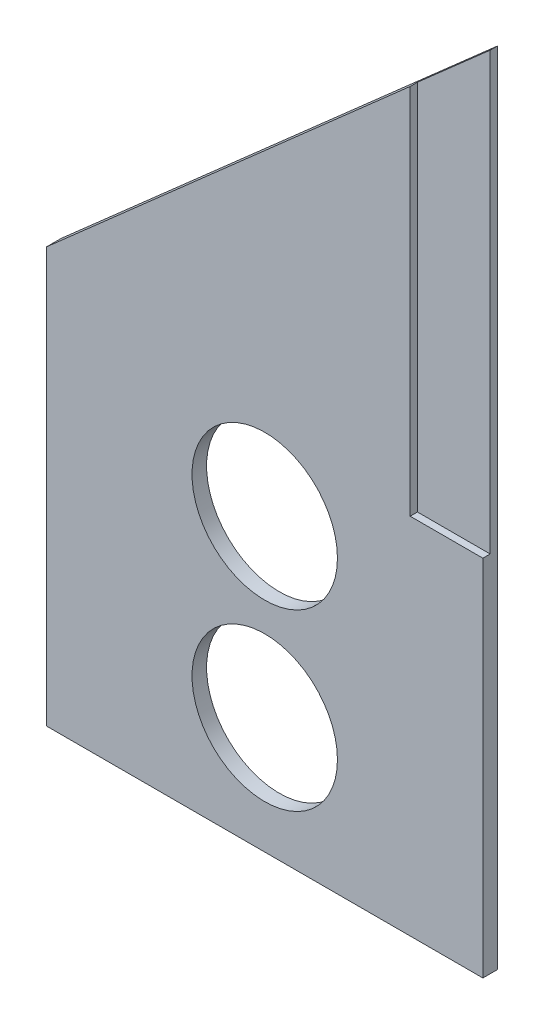
ISO-10303-21;
HEADER;
FILE_DESCRIPTION(('STEP AP214'),'2;1');
FILE_NAME('part.step','',(''),(''),'','','');
FILE_SCHEMA(('AUTOMOTIVE_DESIGN { 1 0 10303 214 1 1 1 1 }'));
ENDSEC;
DATA;
#1=APPLICATION_CONTEXT('core data for automotive mechanical design processes');
#2=APPLICATION_PROTOCOL_DEFINITION('international standard','automotive_design',2000,#1);
#3=PRODUCT_CONTEXT('',#1,'mechanical');
#4=PRODUCT('Part','Part','',(#3));
#5=PRODUCT_RELATED_PRODUCT_CATEGORY('part','',(#4));
#6=PRODUCT_DEFINITION_FORMATION('','',#4);
#7=PRODUCT_DEFINITION_CONTEXT('part definition',#1,'design');
#8=PRODUCT_DEFINITION('design','',#6,#7);
#9=PRODUCT_DEFINITION_SHAPE('','',#8);
#10=(LENGTH_UNIT() NAMED_UNIT(*) SI_UNIT(.MILLI.,.METRE.));
#11=(NAMED_UNIT(*) PLANE_ANGLE_UNIT() SI_UNIT($,.RADIAN.));
#12=(NAMED_UNIT(*) SI_UNIT($,.STERADIAN.) SOLID_ANGLE_UNIT());
#13=UNCERTAINTY_MEASURE_WITH_UNIT(LENGTH_MEASURE(1.E-05),#10,'distance_accuracy_value','');
#14=(GEOMETRIC_REPRESENTATION_CONTEXT(3) GLOBAL_UNCERTAINTY_ASSIGNED_CONTEXT((#13)) GLOBAL_UNIT_ASSIGNED_CONTEXT((#10,
#11,#12)) REPRESENTATION_CONTEXT('',''));
#15=CARTESIAN_POINT('',(0.,0.,0.));
#16=DIRECTION('',(0.,0.,1.));
#17=DIRECTION('',(1.,0.,0.));
#18=AXIS2_PLACEMENT_3D('',#15,#16,#17);
#19=CARTESIAN_POINT('',(-24.8805587892899,19.3298519873607,1.));
#20=DIRECTION('',(-1.,0.,0.));
#21=DIRECTION('',(0.,-1.,0.));
#22=AXIS2_PLACEMENT_3D('',#19,#20,#21);
#23=PLANE('',#22);
#24=DIRECTION('',(0.,1.,0.));
#25=VECTOR('',#24,1.);
#26=CARTESIAN_POINT('',(-24.8805587892899,19.3298519873607,0.5));
#27=LINE('',#26,#25);
#28=CARTESIAN_POINT('',(-24.8805587892899,-10.6701480126393,0.5));
#29=VERTEX_POINT('',#28);
#30=CARTESIAN_POINT('',(-24.8805587892899,19.3298519873607,0.5));
#31=VERTEX_POINT('',#30);
#32=EDGE_CURVE('E106',#29,#31,#27,.T.);
#33=ORIENTED_EDGE('',*,*,#32,.F.);
#34=DIRECTION('',(0.,0.,1.));
#35=VECTOR('',#34,1.);
#36=CARTESIAN_POINT('',(-24.8805587892899,-10.6701480126393,0.5));
#37=LINE('',#36,#35);
#38=CARTESIAN_POINT('',(-24.8805587892899,-10.6701480126393,1.));
#39=VERTEX_POINT('',#38);
#40=EDGE_CURVE('E148',#29,#39,#37,.T.);
#41=ORIENTED_EDGE('',*,*,#40,.T.);
#42=DIRECTION('',(0.,1.,0.));
#43=VECTOR('',#42,1.);
#44=CARTESIAN_POINT('',(-24.8805587892899,19.3298519873607,1.));
#45=LINE('',#44,#43);
#46=CARTESIAN_POINT('',(-24.8805587892899,-35.6701480126393,1.));
#47=VERTEX_POINT('',#46);
#48=EDGE_CURVE('E153',#47,#39,#45,.T.);
#49=ORIENTED_EDGE('',*,*,#48,.F.);
#50=DIRECTION('',(0.,0.,-1.));
#51=VECTOR('',#50,1.);
#52=CARTESIAN_POINT('',(-24.8805587892899,-35.6701480126393,1.));
#53=LINE('',#52,#51);
#54=CARTESIAN_POINT('',(-24.8805587892899,-35.6701480126393,0.));
#55=VERTEX_POINT('',#54);
#56=EDGE_CURVE('E159',#47,#55,#53,.T.);
#57=ORIENTED_EDGE('',*,*,#56,.T.);
#58=DIRECTION('',(0.,1.,0.));
#59=VECTOR('',#58,1.);
#60=CARTESIAN_POINT('',(-24.8805587892899,19.3298519873607,0.));
#61=LINE('',#60,#59);
#62=CARTESIAN_POINT('',(-24.8805587892899,19.3298519873607,0.));
#63=VERTEX_POINT('',#62);
#64=EDGE_CURVE('E122',#55,#63,#61,.T.);
#65=ORIENTED_EDGE('',*,*,#64,.T.);
#66=DIRECTION('',(0.,0.,-1.));
#67=VECTOR('',#66,1.);
#68=CARTESIAN_POINT('',(-24.8805587892899,19.3298519873607,1.));
#69=LINE('',#68,#67);
#70=EDGE_CURVE('E118',#31,#63,#69,.T.);
#71=ORIENTED_EDGE('',*,*,#70,.F.);
#72=EDGE_LOOP('',(#33,#41,#49,#57,#65,#71));
#73=FACE_BOUND('',#72,.T.);
#74=ADVANCED_FACE('F36',(#73),#23,.F.);
#75=CARTESIAN_POINT('',(-24.8805587892899,19.3298519873607,1.));
#76=DIRECTION('',(0.661437827766148,-0.75,0.));
#77=DIRECTION('',(0.75,0.661437827766148,0.));
#78=AXIS2_PLACEMENT_3D('',#75,#76,#77);
#79=PLANE('',#78);
#80=DIRECTION('',(-0.75,-0.661437827766148,0.));
#81=VECTOR('',#80,1.);
#82=CARTESIAN_POINT('',(-24.8805587892899,19.3298519873607,1.));
#83=LINE('',#82,#81);
#84=CARTESIAN_POINT('',(-29.8805587892899,14.9202664689197,1.));
#85=VERTEX_POINT('',#84);
#86=CARTESIAN_POINT('',(-54.8805587892899,-7.12766112328518,1.));
#87=VERTEX_POINT('',#86);
#88=EDGE_CURVE('E85',#85,#87,#83,.T.);
#89=ORIENTED_EDGE('',*,*,#88,.F.);
#90=DIRECTION('',(0.,0.,-1.));
#91=VECTOR('',#90,1.);
#92=CARTESIAN_POINT('',(-29.8805587892899,14.9202664689197,1.));
#93=LINE('',#92,#91);
#94=CARTESIAN_POINT('',(-29.8805587892899,14.9202664689197,0.5));
#95=VERTEX_POINT('',#94);
#96=EDGE_CURVE('E52',#85,#95,#93,.T.);
#97=ORIENTED_EDGE('',*,*,#96,.T.);
#98=DIRECTION('',(0.75,0.661437827766148,0.));
#99=VECTOR('',#98,1.);
#100=CARTESIAN_POINT('',(-24.8805587892899,19.3298519873607,0.5));
#101=LINE('',#100,#99);
#102=EDGE_CURVE('E11',#95,#31,#101,.T.);
#103=ORIENTED_EDGE('',*,*,#102,.T.);
#104=ORIENTED_EDGE('',*,*,#70,.T.);
#105=DIRECTION('',(-0.75,-0.661437827766148,0.));
#106=VECTOR('',#105,1.);
#107=CARTESIAN_POINT('',(-24.8805587892899,19.3298519873607,0.));
#108=LINE('',#107,#106);
#109=CARTESIAN_POINT('',(-54.8805587892899,-7.12766112328518,0.));
#110=VERTEX_POINT('',#109);
#111=EDGE_CURVE('E161',#63,#110,#108,.T.);
#112=ORIENTED_EDGE('',*,*,#111,.T.);
#113=DIRECTION('',(0.,0.,-1.));
#114=VECTOR('',#113,1.);
#115=CARTESIAN_POINT('',(-54.8805587892899,-7.12766112328518,1.));
#116=LINE('',#115,#114);
#117=EDGE_CURVE('E123',#87,#110,#116,.T.);
#118=ORIENTED_EDGE('',*,*,#117,.F.);
#119=EDGE_LOOP('',(#89,#97,#103,#104,#112,#118));
#120=FACE_BOUND('',#119,.T.);
#121=ADVANCED_FACE('F117',(#120),#79,.F.);
#122=CARTESIAN_POINT('',(-54.8805587892899,-7.12766112328518,1.));
#123=DIRECTION('',(1.,0.,0.));
#124=DIRECTION('',(0.,1.,0.));
#125=AXIS2_PLACEMENT_3D('',#122,#123,#124);
#126=PLANE('',#125);
#127=DIRECTION('',(0.,-1.,0.));
#128=VECTOR('',#127,1.);
#129=CARTESIAN_POINT('',(-54.8805587892899,-7.12766112328518,0.));
#130=LINE('',#129,#128);
#131=CARTESIAN_POINT('',(-54.8805587892898,-35.6701480126393,0.));
#132=VERTEX_POINT('',#131);
#133=EDGE_CURVE('E163',#110,#132,#130,.T.);
#134=ORIENTED_EDGE('',*,*,#133,.T.);
#135=DIRECTION('',(0.,0.,-1.));
#136=VECTOR('',#135,1.);
#137=CARTESIAN_POINT('',(-54.8805587892898,-35.6701480126393,1.));
#138=LINE('',#137,#136);
#139=CARTESIAN_POINT('',(-54.8805587892898,-35.6701480126393,1.));
#140=VERTEX_POINT('',#139);
#141=EDGE_CURVE('E127',#140,#132,#138,.T.);
#142=ORIENTED_EDGE('',*,*,#141,.F.);
#143=DIRECTION('',(0.,-1.,0.));
#144=VECTOR('',#143,1.);
#145=CARTESIAN_POINT('',(-54.8805587892899,-7.12766112328518,1.));
#146=LINE('',#145,#144);
#147=EDGE_CURVE('E156',#87,#140,#146,.T.);
#148=ORIENTED_EDGE('',*,*,#147,.F.);
#149=ORIENTED_EDGE('',*,*,#117,.T.);
#150=EDGE_LOOP('',(#134,#142,#148,#149));
#151=FACE_BOUND('',#150,.T.);
#152=ADVANCED_FACE('F173',(#151),#126,.F.);
#153=CARTESIAN_POINT('',(-54.8805587892898,-35.6701480126393,1.));
#154=DIRECTION('',(0.,1.,0.));
#155=DIRECTION('',(0.,0.,1.));
#156=AXIS2_PLACEMENT_3D('',#153,#154,#155);
#157=PLANE('',#156);
#158=DIRECTION('',(1.,0.,0.));
#159=VECTOR('',#158,1.);
#160=CARTESIAN_POINT('',(-54.8805587892898,-35.6701480126393,0.));
#161=LINE('',#160,#159);
#162=EDGE_CURVE('E81',#132,#55,#161,.T.);
#163=ORIENTED_EDGE('',*,*,#162,.T.);
#164=ORIENTED_EDGE('',*,*,#56,.F.);
#165=DIRECTION('',(1.,0.,0.));
#166=VECTOR('',#165,1.);
#167=CARTESIAN_POINT('',(-54.8805587892898,-35.6701480126393,1.));
#168=LINE('',#167,#166);
#169=EDGE_CURVE('E61',#140,#47,#168,.T.);
#170=ORIENTED_EDGE('',*,*,#169,.F.);
#171=ORIENTED_EDGE('',*,*,#141,.T.);
#172=EDGE_LOOP('',(#163,#164,#170,#171));
#173=FACE_BOUND('',#172,.T.);
#174=ADVANCED_FACE('F167',(#173),#157,.F.);
#175=CARTESIAN_POINT('',(0.,0.,1.));
#176=DIRECTION('',(0.,0.,1.));
#177=DIRECTION('',(1.,0.,0.));
#178=AXIS2_PLACEMENT_3D('',#175,#176,#177);
#179=PLANE('',#178);
#180=CARTESIAN_POINT('',(-39.8805587892899,-27.6701480126393,1.));
#181=DIRECTION('',(0.,0.,1.));
#182=DIRECTION('',(1.,0.,0.));
#183=AXIS2_PLACEMENT_3D('',#180,#181,#182);
#184=CIRCLE('',#183,5.);
#185=CARTESIAN_POINT('',(-34.8805587892899,-27.6701480126393,1.));
#186=VERTEX_POINT('',#185);
#187=EDGE_CURVE('E132',#186,#186,#184,.T.);
#188=ORIENTED_EDGE('',*,*,#187,.F.);
#189=EDGE_LOOP('',(#188));
#190=FACE_BOUND('',#189,.T.);
#191=CARTESIAN_POINT('',(-39.8805587892899,-15.6701480126393,1.));
#192=DIRECTION('',(0.,0.,1.));
#193=DIRECTION('',(1.,0.,0.));
#194=AXIS2_PLACEMENT_3D('',#191,#192,#193);
#195=CIRCLE('',#194,5.);
#196=CARTESIAN_POINT('',(-34.8805587892899,-15.6701480126393,1.));
#197=VERTEX_POINT('',#196);
#198=EDGE_CURVE('E137',#197,#197,#195,.T.);
#199=ORIENTED_EDGE('',*,*,#198,.F.);
#200=EDGE_LOOP('',(#199));
#201=FACE_BOUND('',#200,.T.);
#202=DIRECTION('',(1.,0.,0.));
#203=VECTOR('',#202,1.);
#204=CARTESIAN_POINT('',(-24.8805587892899,-10.6701480126393,1.));
#205=LINE('',#204,#203);
#206=CARTESIAN_POINT('',(-29.8805587892899,-10.6701480126393,1.));
#207=VERTEX_POINT('',#206);
#208=EDGE_CURVE('E114',#207,#39,#205,.T.);
#209=ORIENTED_EDGE('',*,*,#208,.F.);
#210=DIRECTION('',(0.,-1.,0.));
#211=VECTOR('',#210,1.);
#212=CARTESIAN_POINT('',(-29.8805587892899,0.,1.));
#213=LINE('',#212,#211);
#214=EDGE_CURVE('E44',#85,#207,#213,.T.);
#215=ORIENTED_EDGE('',*,*,#214,.F.);
#216=ORIENTED_EDGE('',*,*,#88,.T.);
#217=ORIENTED_EDGE('',*,*,#147,.T.);
#218=ORIENTED_EDGE('',*,*,#169,.T.);
#219=ORIENTED_EDGE('',*,*,#48,.T.);
#220=EDGE_LOOP('',(#209,#215,#216,#217,#218,#219));
#221=FACE_BOUND('',#220,.T.);
#222=ADVANCED_FACE('F175',(#190,#201,#221),#179,.T.);
#223=CARTESIAN_POINT('',(0.,0.,0.));
#224=DIRECTION('',(0.,0.,1.));
#225=DIRECTION('',(1.,0.,0.));
#226=AXIS2_PLACEMENT_3D('',#223,#224,#225);
#227=PLANE('',#226);
#228=CARTESIAN_POINT('',(-39.8805587892899,-27.6701480126393,0.));
#229=DIRECTION('',(0.,0.,1.));
#230=DIRECTION('',(1.,0.,0.));
#231=AXIS2_PLACEMENT_3D('',#228,#229,#230);
#232=CIRCLE('',#231,5.);
#233=CARTESIAN_POINT('',(-34.8805587892899,-27.6701480126393,0.));
#234=VERTEX_POINT('',#233);
#235=EDGE_CURVE('E39',#234,#234,#232,.T.);
#236=ORIENTED_EDGE('',*,*,#235,.T.);
#237=EDGE_LOOP('',(#236));
#238=FACE_BOUND('',#237,.T.);
#239=CARTESIAN_POINT('',(-39.8805587892899,-15.6701480126393,0.));
#240=DIRECTION('',(0.,0.,1.));
#241=DIRECTION('',(1.,0.,0.));
#242=AXIS2_PLACEMENT_3D('',#239,#240,#241);
#243=CIRCLE('',#242,5.);
#244=CARTESIAN_POINT('',(-34.8805587892899,-15.6701480126393,0.));
#245=VERTEX_POINT('',#244);
#246=EDGE_CURVE('E130',#245,#245,#243,.T.);
#247=ORIENTED_EDGE('',*,*,#246,.T.);
#248=EDGE_LOOP('',(#247));
#249=FACE_BOUND('',#248,.T.);
#250=ORIENTED_EDGE('',*,*,#64,.F.);
#251=ORIENTED_EDGE('',*,*,#162,.F.);
#252=ORIENTED_EDGE('',*,*,#133,.F.);
#253=ORIENTED_EDGE('',*,*,#111,.F.);
#254=EDGE_LOOP('',(#250,#251,#252,#253));
#255=FACE_BOUND('',#254,.T.);
#256=ADVANCED_FACE('F172',(#238,#249,#255),#227,.F.);
#257=CARTESIAN_POINT('',(0.,0.,0.5));
#258=DIRECTION('',(0.,0.,-1.));
#259=DIRECTION('',(-1.,0.,0.));
#260=AXIS2_PLACEMENT_3D('',#257,#258,#259);
#261=PLANE('',#260);
#262=DIRECTION('',(0.,-1.,0.));
#263=VECTOR('',#262,1.);
#264=CARTESIAN_POINT('',(-29.8805587892899,19.3298519873607,0.5));
#265=LINE('',#264,#263);
#266=CARTESIAN_POINT('',(-29.8805587892899,-10.6701480126393,0.5));
#267=VERTEX_POINT('',#266);
#268=EDGE_CURVE('E113',#95,#267,#265,.T.);
#269=ORIENTED_EDGE('',*,*,#268,.T.);
#270=DIRECTION('',(1.,0.,0.));
#271=VECTOR('',#270,1.);
#272=CARTESIAN_POINT('',(-24.8805587892899,-10.6701480126393,0.5));
#273=LINE('',#272,#271);
#274=EDGE_CURVE('E109',#267,#29,#273,.T.);
#275=ORIENTED_EDGE('',*,*,#274,.T.);
#276=ORIENTED_EDGE('',*,*,#32,.T.);
#277=ORIENTED_EDGE('',*,*,#102,.F.);
#278=EDGE_LOOP('',(#269,#275,#276,#277));
#279=FACE_BOUND('',#278,.T.);
#280=ADVANCED_FACE('F107',(#279),#261,.F.);
#281=CARTESIAN_POINT('',(-29.8805587892899,19.3298519873607,0.5));
#282=DIRECTION('',(-1.,0.,0.));
#283=DIRECTION('',(0.,-1.,0.));
#284=AXIS2_PLACEMENT_3D('',#281,#282,#283);
#285=PLANE('',#284);
#286=ORIENTED_EDGE('',*,*,#214,.T.);
#287=DIRECTION('',(0.,0.,1.));
#288=VECTOR('',#287,1.);
#289=CARTESIAN_POINT('',(-29.8805587892899,-10.6701480126393,0.5));
#290=LINE('',#289,#288);
#291=EDGE_CURVE('E146',#267,#207,#290,.T.);
#292=ORIENTED_EDGE('',*,*,#291,.F.);
#293=ORIENTED_EDGE('',*,*,#268,.F.);
#294=ORIENTED_EDGE('',*,*,#96,.F.);
#295=EDGE_LOOP('',(#286,#292,#293,#294));
#296=FACE_BOUND('',#295,.T.);
#297=ADVANCED_FACE('F220',(#296),#285,.F.);
#298=CARTESIAN_POINT('',(-24.8805587892899,-10.6701480126393,0.5));
#299=DIRECTION('',(0.,-1.,0.));
#300=DIRECTION('',(0.,0.,-1.));
#301=AXIS2_PLACEMENT_3D('',#298,#299,#300);
#302=PLANE('',#301);
#303=ORIENTED_EDGE('',*,*,#208,.T.);
#304=ORIENTED_EDGE('',*,*,#40,.F.);
#305=ORIENTED_EDGE('',*,*,#274,.F.);
#306=ORIENTED_EDGE('',*,*,#291,.T.);
#307=EDGE_LOOP('',(#303,#304,#305,#306));
#308=FACE_BOUND('',#307,.T.);
#309=ADVANCED_FACE('F230',(#308),#302,.F.);
#310=CARTESIAN_POINT('',(-39.8805587892899,-15.6701480126393,-8.));
#311=DIRECTION('',(0.,0.,1.));
#312=DIRECTION('',(1.,0.,0.));
#313=AXIS2_PLACEMENT_3D('',#310,#311,#312);
#314=CYLINDRICAL_SURFACE('',#313,5.);
#315=ORIENTED_EDGE('',*,*,#198,.T.);
#316=EDGE_LOOP('',(#315));
#317=FACE_BOUND('',#316,.T.);
#318=ORIENTED_EDGE('',*,*,#246,.F.);
#319=EDGE_LOOP('',(#318));
#320=FACE_BOUND('',#319,.T.);
#321=ADVANCED_FACE('F237',(#317,#320),#314,.F.);
#322=CARTESIAN_POINT('',(-39.8805587892899,-27.6701480126393,-8.));
#323=DIRECTION('',(0.,0.,1.));
#324=DIRECTION('',(1.,0.,0.));
#325=AXIS2_PLACEMENT_3D('',#322,#323,#324);
#326=CYLINDRICAL_SURFACE('',#325,5.);
#327=ORIENTED_EDGE('',*,*,#187,.T.);
#328=EDGE_LOOP('',(#327));
#329=FACE_BOUND('',#328,.T.);
#330=ORIENTED_EDGE('',*,*,#235,.F.);
#331=EDGE_LOOP('',(#330));
#332=FACE_BOUND('',#331,.T.);
#333=ADVANCED_FACE('F256',(#329,#332),#326,.F.);
#334=CLOSED_SHELL('',(#74,#121,#152,#174,#222,#256,#280,#297,#309,#321,#333));
#335=MANIFOLD_SOLID_BREP('B2',#334);
#336=ADVANCED_BREP_SHAPE_REPRESENTATION('',(#18,#335),#14);
#337=SHAPE_DEFINITION_REPRESENTATION(#9,#336);
ENDSEC;
END-ISO-10303-21;
